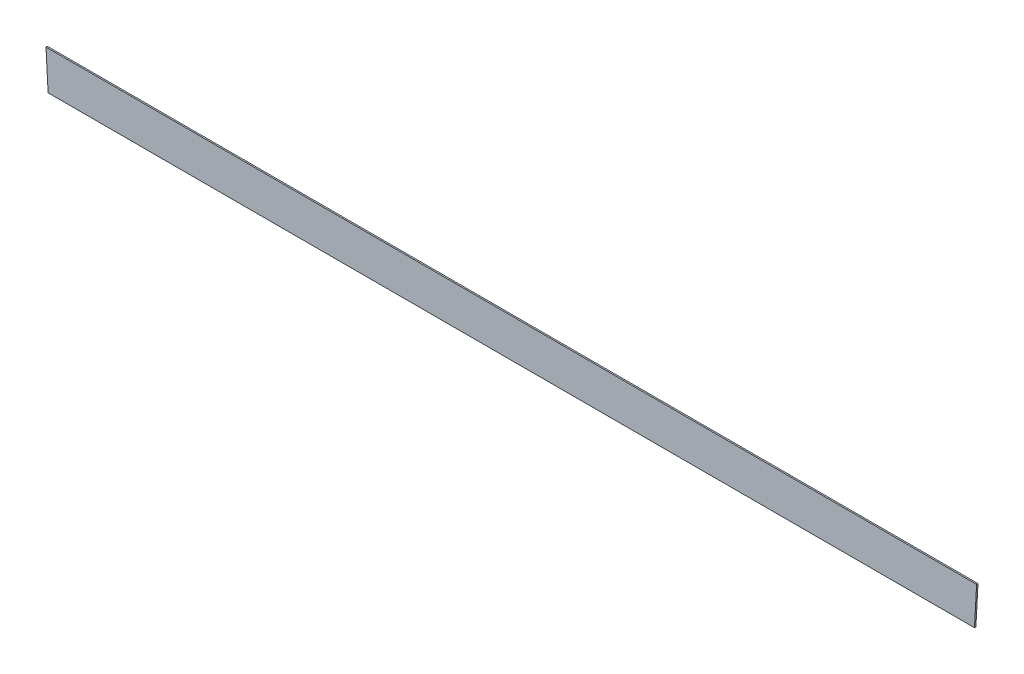
ISO-10303-21;
HEADER;
FILE_DESCRIPTION(('STEP AP214'),'2;1');
FILE_NAME('part.step','',(''),(''),'','','');
FILE_SCHEMA(('AUTOMOTIVE_DESIGN { 1 0 10303 214 1 1 1 1 }'));
ENDSEC;
DATA;
#1=APPLICATION_CONTEXT('core data for automotive mechanical design processes');
#2=APPLICATION_PROTOCOL_DEFINITION('international standard','automotive_design',2000,#1);
#3=PRODUCT_CONTEXT('',#1,'mechanical');
#4=PRODUCT('Part','Part','',(#3));
#5=PRODUCT_RELATED_PRODUCT_CATEGORY('part','',(#4));
#6=PRODUCT_DEFINITION_FORMATION('','',#4);
#7=PRODUCT_DEFINITION_CONTEXT('part definition',#1,'design');
#8=PRODUCT_DEFINITION('design','',#6,#7);
#9=PRODUCT_DEFINITION_SHAPE('','',#8);
#10=(LENGTH_UNIT() NAMED_UNIT(*) SI_UNIT(.MILLI.,.METRE.));
#11=(NAMED_UNIT(*) PLANE_ANGLE_UNIT() SI_UNIT($,.RADIAN.));
#12=(NAMED_UNIT(*) SI_UNIT($,.STERADIAN.) SOLID_ANGLE_UNIT());
#13=UNCERTAINTY_MEASURE_WITH_UNIT(LENGTH_MEASURE(1.E-05),#10,'distance_accuracy_value','');
#14=(GEOMETRIC_REPRESENTATION_CONTEXT(3) GLOBAL_UNCERTAINTY_ASSIGNED_CONTEXT((#13)) GLOBAL_UNIT_ASSIGNED_CONTEXT((#10,
#11,#12)) REPRESENTATION_CONTEXT('',''));
#15=CARTESIAN_POINT('',(0.,0.,0.));
#16=DIRECTION('',(0.,0.,1.));
#17=DIRECTION('',(1.,0.,0.));
#18=AXIS2_PLACEMENT_3D('',#15,#16,#17);
#19=CARTESIAN_POINT('',(-660.5,27.5,2.));
#20=DIRECTION('',(0.,-1.,0.));
#21=DIRECTION('',(0.,0.,-1.));
#22=AXIS2_PLACEMENT_3D('',#19,#20,#21);
#23=PLANE('',#22);
#24=DIRECTION('',(-1.,0.,0.));
#25=VECTOR('',#24,1.);
#26=CARTESIAN_POINT('',(-660.5,27.5,0.));
#27=LINE('',#26,#25);
#28=CARTESIAN_POINT('',(663.5,27.5,0.));
#29=VERTEX_POINT('',#28);
#30=CARTESIAN_POINT('',(-663.5,27.5,0.));
#31=VERTEX_POINT('',#30);
#32=EDGE_CURVE('E72',#29,#31,#27,.T.);
#33=ORIENTED_EDGE('',*,*,#32,.T.);
#34=DIRECTION('',(0.,0.,-1.));
#35=VECTOR('',#34,1.);
#36=CARTESIAN_POINT('',(-663.5,27.5,2.));
#37=LINE('',#36,#35);
#38=CARTESIAN_POINT('',(-663.5,27.5,2.));
#39=VERTEX_POINT('',#38);
#40=EDGE_CURVE('E11',#39,#31,#37,.T.);
#41=ORIENTED_EDGE('',*,*,#40,.F.);
#42=DIRECTION('',(-1.,0.,0.));
#43=VECTOR('',#42,1.);
#44=CARTESIAN_POINT('',(660.5,27.5,2.));
#45=LINE('',#44,#43);
#46=CARTESIAN_POINT('',(663.5,27.5,2.));
#47=VERTEX_POINT('',#46);
#48=EDGE_CURVE('E77',#47,#39,#45,.T.);
#49=ORIENTED_EDGE('',*,*,#48,.F.);
#50=DIRECTION('',(0.,0.,-1.));
#51=VECTOR('',#50,1.);
#52=CARTESIAN_POINT('',(663.5,27.5,2.));
#53=LINE('',#52,#51);
#54=EDGE_CURVE('E92',#47,#29,#53,.T.);
#55=ORIENTED_EDGE('',*,*,#54,.T.);
#56=EDGE_LOOP('',(#33,#41,#49,#55));
#57=FACE_BOUND('',#56,.T.);
#58=ADVANCED_FACE('F32',(#57),#23,.F.);
#59=CARTESIAN_POINT('',(-663.5,27.5,2.));
#60=DIRECTION('',(0.998515707930946,0.0544644931598718,0.));
#61=DIRECTION('',(-0.0544644931598718,0.998515707930946,0.));
#62=AXIS2_PLACEMENT_3D('',#59,#60,#61);
#63=PLANE('',#62);
#64=DIRECTION('',(0.0544644931598718,-0.998515707930946,0.));
#65=VECTOR('',#64,1.);
#66=CARTESIAN_POINT('',(-663.5,27.5,0.));
#67=LINE('',#66,#65);
#68=CARTESIAN_POINT('',(-660.5,-27.5,0.));
#69=VERTEX_POINT('',#68);
#70=EDGE_CURVE('E88',#31,#69,#67,.T.);
#71=ORIENTED_EDGE('',*,*,#70,.T.);
#72=DIRECTION('',(0.,0.,-1.));
#73=VECTOR('',#72,1.);
#74=CARTESIAN_POINT('',(-660.5,-27.5,2.));
#75=LINE('',#74,#73);
#76=CARTESIAN_POINT('',(-660.5,-27.5,2.));
#77=VERTEX_POINT('',#76);
#78=EDGE_CURVE('E40',#77,#69,#75,.T.);
#79=ORIENTED_EDGE('',*,*,#78,.F.);
#80=DIRECTION('',(0.0544644931598718,-0.998515707930946,0.));
#81=VECTOR('',#80,1.);
#82=CARTESIAN_POINT('',(-663.5,27.5,2.));
#83=LINE('',#82,#81);
#84=EDGE_CURVE('E80',#39,#77,#83,.T.);
#85=ORIENTED_EDGE('',*,*,#84,.F.);
#86=ORIENTED_EDGE('',*,*,#40,.T.);
#87=EDGE_LOOP('',(#71,#79,#85,#86));
#88=FACE_BOUND('',#87,.T.);
#89=ADVANCED_FACE('F87',(#88),#63,.F.);
#90=CARTESIAN_POINT('',(-660.5,-27.5,2.));
#91=DIRECTION('',(0.,1.,0.));
#92=DIRECTION('',(0.,0.,1.));
#93=AXIS2_PLACEMENT_3D('',#90,#91,#92);
#94=PLANE('',#93);
#95=DIRECTION('',(1.,0.,0.));
#96=VECTOR('',#95,1.);
#97=CARTESIAN_POINT('',(-660.5,-27.5,0.));
#98=LINE('',#97,#96);
#99=CARTESIAN_POINT('',(660.5,-27.5,0.));
#100=VERTEX_POINT('',#99);
#101=EDGE_CURVE('E65',#69,#100,#98,.T.);
#102=ORIENTED_EDGE('',*,*,#101,.T.);
#103=DIRECTION('',(0.,0.,-1.));
#104=VECTOR('',#103,1.);
#105=CARTESIAN_POINT('',(660.5,-27.5,2.));
#106=LINE('',#105,#104);
#107=CARTESIAN_POINT('',(660.5,-27.5,2.));
#108=VERTEX_POINT('',#107);
#109=EDGE_CURVE('E89',#108,#100,#106,.T.);
#110=ORIENTED_EDGE('',*,*,#109,.F.);
#111=DIRECTION('',(1.,0.,0.));
#112=VECTOR('',#111,1.);
#113=CARTESIAN_POINT('',(-660.5,-27.5,2.));
#114=LINE('',#113,#112);
#115=EDGE_CURVE('E84',#77,#108,#114,.T.);
#116=ORIENTED_EDGE('',*,*,#115,.F.);
#117=ORIENTED_EDGE('',*,*,#78,.T.);
#118=EDGE_LOOP('',(#102,#110,#116,#117));
#119=FACE_BOUND('',#118,.T.);
#120=ADVANCED_FACE('F90',(#119),#94,.F.);
#121=CARTESIAN_POINT('',(663.5,27.5,2.));
#122=DIRECTION('',(-0.998515707930946,0.0544644931598678,0.));
#123=DIRECTION('',(-0.0544644931598678,-0.998515707930946,0.));
#124=AXIS2_PLACEMENT_3D('',#121,#122,#123);
#125=PLANE('',#124);
#126=DIRECTION('',(0.0544644931598678,0.998515707930946,0.));
#127=VECTOR('',#126,1.);
#128=CARTESIAN_POINT('',(663.5,27.5,0.));
#129=LINE('',#128,#127);
#130=EDGE_CURVE('E99',#100,#29,#129,.T.);
#131=ORIENTED_EDGE('',*,*,#130,.T.);
#132=ORIENTED_EDGE('',*,*,#54,.F.);
#133=DIRECTION('',(0.0544644931598678,0.998515707930946,0.));
#134=VECTOR('',#133,1.);
#135=CARTESIAN_POINT('',(663.5,27.5,2.));
#136=LINE('',#135,#134);
#137=EDGE_CURVE('E48',#108,#47,#136,.T.);
#138=ORIENTED_EDGE('',*,*,#137,.F.);
#139=ORIENTED_EDGE('',*,*,#109,.T.);
#140=EDGE_LOOP('',(#131,#132,#138,#139));
#141=FACE_BOUND('',#140,.T.);
#142=ADVANCED_FACE('F104',(#141),#125,.F.);
#143=CARTESIAN_POINT('',(0.,0.,2.));
#144=DIRECTION('',(0.,0.,-1.));
#145=DIRECTION('',(-1.,0.,0.));
#146=AXIS2_PLACEMENT_3D('',#143,#144,#145);
#147=PLANE('',#146);
#148=ORIENTED_EDGE('',*,*,#48,.T.);
#149=ORIENTED_EDGE('',*,*,#84,.T.);
#150=ORIENTED_EDGE('',*,*,#115,.T.);
#151=ORIENTED_EDGE('',*,*,#137,.T.);
#152=EDGE_LOOP('',(#148,#149,#150,#151));
#153=FACE_BOUND('',#152,.T.);
#154=ADVANCED_FACE('F82',(#153),#147,.F.);
#155=CARTESIAN_POINT('',(0.,0.,0.));
#156=DIRECTION('',(0.,0.,-1.));
#157=DIRECTION('',(-1.,0.,0.));
#158=AXIS2_PLACEMENT_3D('',#155,#156,#157);
#159=PLANE('',#158);
#160=ORIENTED_EDGE('',*,*,#32,.F.);
#161=ORIENTED_EDGE('',*,*,#130,.F.);
#162=ORIENTED_EDGE('',*,*,#101,.F.);
#163=ORIENTED_EDGE('',*,*,#70,.F.);
#164=EDGE_LOOP('',(#160,#161,#162,#163));
#165=FACE_BOUND('',#164,.T.);
#166=ADVANCED_FACE('F105',(#165),#159,.T.);
#167=CLOSED_SHELL('',(#58,#89,#120,#142,#154,#166));
#168=MANIFOLD_SOLID_BREP('B2',#167);
#169=ADVANCED_BREP_SHAPE_REPRESENTATION('',(#18,#168),#14);
#170=SHAPE_DEFINITION_REPRESENTATION(#9,#169);
ENDSEC;
END-ISO-10303-21;
